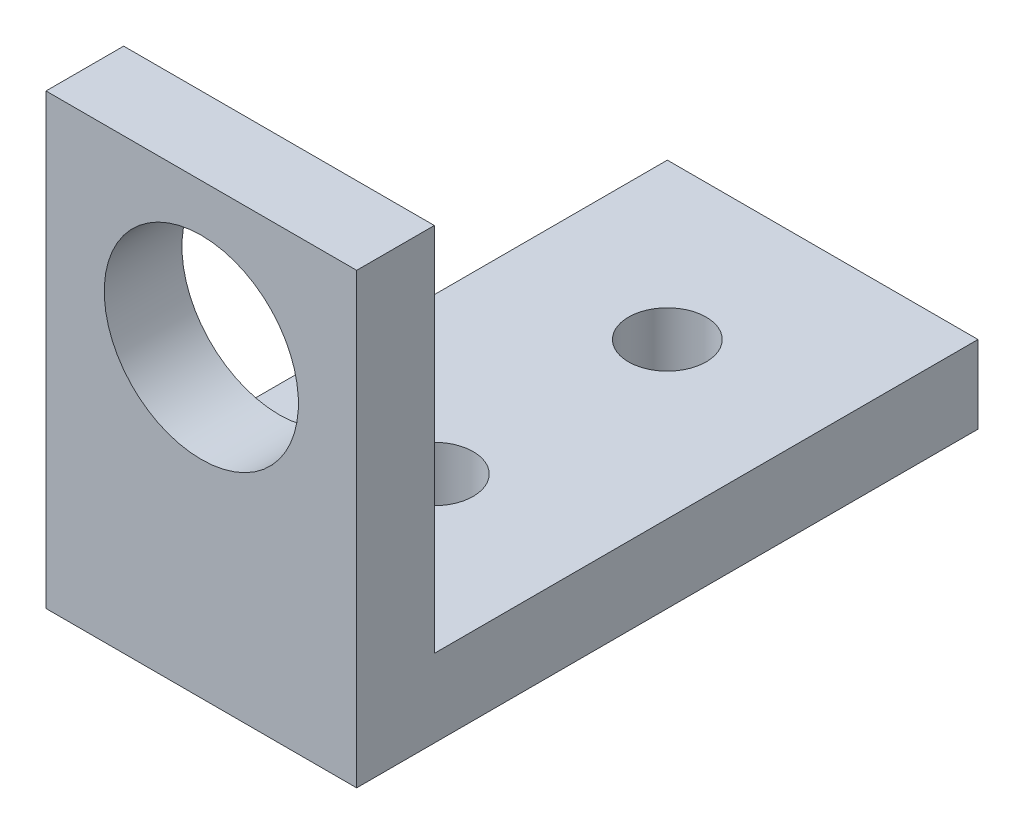
ISO-10303-21;
HEADER;
FILE_DESCRIPTION(('STEP AP214'),'2;1');
FILE_NAME('part.step','',(''),(''),'','','');
FILE_SCHEMA(('AUTOMOTIVE_DESIGN { 1 0 10303 214 1 1 1 1 }'));
ENDSEC;
DATA;
#1=APPLICATION_CONTEXT('core data for automotive mechanical design processes');
#2=APPLICATION_PROTOCOL_DEFINITION('international standard','automotive_design',2000,#1);
#3=PRODUCT_CONTEXT('',#1,'mechanical');
#4=PRODUCT('Part','Part','',(#3));
#5=PRODUCT_RELATED_PRODUCT_CATEGORY('part','',(#4));
#6=PRODUCT_DEFINITION_FORMATION('','',#4);
#7=PRODUCT_DEFINITION_CONTEXT('part definition',#1,'design');
#8=PRODUCT_DEFINITION('design','',#6,#7);
#9=PRODUCT_DEFINITION_SHAPE('','',#8);
#10=(LENGTH_UNIT() NAMED_UNIT(*) SI_UNIT(.MILLI.,.METRE.));
#11=(NAMED_UNIT(*) PLANE_ANGLE_UNIT() SI_UNIT($,.RADIAN.));
#12=(NAMED_UNIT(*) SI_UNIT($,.STERADIAN.) SOLID_ANGLE_UNIT());
#13=UNCERTAINTY_MEASURE_WITH_UNIT(LENGTH_MEASURE(1.E-05),#10,'distance_accuracy_value','');
#14=(GEOMETRIC_REPRESENTATION_CONTEXT(3) GLOBAL_UNCERTAINTY_ASSIGNED_CONTEXT((#13)) GLOBAL_UNIT_ASSIGNED_CONTEXT((#10,
#11,#12)) REPRESENTATION_CONTEXT('',''));
#15=CARTESIAN_POINT('',(0.,0.,0.));
#16=DIRECTION('',(0.,0.,1.));
#17=DIRECTION('',(1.,0.,0.));
#18=AXIS2_PLACEMENT_3D('',#15,#16,#17);
#19=CARTESIAN_POINT('',(25.4,76.2,-6.35));
#20=DIRECTION('',(0.,0.,1.));
#21=DIRECTION('',(0.,-1.,0.));
#22=AXIS2_PLACEMENT_3D('',#19,#20,#21);
#23=PLANE('',#22);
#24=DIRECTION('',(0.,1.,0.));
#25=VECTOR('',#24,1.);
#26=CARTESIAN_POINT('',(0.,76.2,-6.35));
#27=LINE('',#26,#25);
#28=CARTESIAN_POINT('',(0.,6.35,-6.35));
#29=VERTEX_POINT('',#28);
#30=CARTESIAN_POINT('',(0.,36.6475392003736,-6.35));
#31=VERTEX_POINT('',#30);
#32=EDGE_CURVE('E123',#29,#31,#27,.T.);
#33=ORIENTED_EDGE('',*,*,#32,.T.);
#34=DIRECTION('',(-1.,0.,0.));
#35=VECTOR('',#34,1.);
#36=CARTESIAN_POINT('',(0.,36.6475392003736,-6.35));
#37=LINE('',#36,#35);
#38=CARTESIAN_POINT('',(25.4,36.6475392003736,-6.35));
#39=VERTEX_POINT('',#38);
#40=EDGE_CURVE('E48',#39,#31,#37,.T.);
#41=ORIENTED_EDGE('',*,*,#40,.F.);
#42=DIRECTION('',(0.,1.,0.));
#43=VECTOR('',#42,1.);
#44=CARTESIAN_POINT('',(25.4,76.2,-6.35));
#45=LINE('',#44,#43);
#46=CARTESIAN_POINT('',(25.4,6.35,-6.35));
#47=VERTEX_POINT('',#46);
#48=EDGE_CURVE('E118',#47,#39,#45,.T.);
#49=ORIENTED_EDGE('',*,*,#48,.F.);
#50=DIRECTION('',(-1.,0.,0.));
#51=VECTOR('',#50,1.);
#52=CARTESIAN_POINT('',(25.4,6.35,-6.35));
#53=LINE('',#52,#51);
#54=EDGE_CURVE('E125',#47,#29,#53,.T.);
#55=ORIENTED_EDGE('',*,*,#54,.T.);
#56=EDGE_LOOP('',(#33,#41,#49,#55));
#57=FACE_BOUND('',#56,.T.);
#58=CARTESIAN_POINT('',(12.7,24.8412,-6.35));
#59=DIRECTION('',(0.,0.,-1.));
#60=DIRECTION('',(0.,1.,0.));
#61=AXIS2_PLACEMENT_3D('',#58,#59,#60);
#62=CIRCLE('',#61,7.93749999999999);
#63=CARTESIAN_POINT('',(12.7,32.7787,-6.35));
#64=VERTEX_POINT('',#63);
#65=EDGE_CURVE('E157',#64,#64,#62,.T.);
#66=ORIENTED_EDGE('',*,*,#65,.F.);
#67=EDGE_LOOP('',(#66));
#68=FACE_BOUND('',#67,.T.);
#69=ADVANCED_FACE('F33',(#57,#68),#23,.F.);
#70=CARTESIAN_POINT('',(25.4,76.2,0.));
#71=DIRECTION('',(0.,0.,-1.));
#72=DIRECTION('',(0.,1.,0.));
#73=AXIS2_PLACEMENT_3D('',#70,#71,#72);
#74=PLANE('',#73);
#75=CARTESIAN_POINT('',(12.7,24.8412,0.));
#76=DIRECTION('',(0.,0.,-1.));
#77=DIRECTION('',(0.,1.,0.));
#78=AXIS2_PLACEMENT_3D('',#75,#76,#77);
#79=CIRCLE('',#78,7.93749999999999);
#80=CARTESIAN_POINT('',(12.7,32.7787,0.));
#81=VERTEX_POINT('',#80);
#82=EDGE_CURVE('E154',#81,#81,#79,.T.);
#83=ORIENTED_EDGE('',*,*,#82,.T.);
#84=EDGE_LOOP('',(#83));
#85=FACE_BOUND('',#84,.T.);
#86=DIRECTION('',(0.,-1.,0.));
#87=VECTOR('',#86,1.);
#88=CARTESIAN_POINT('',(25.4,76.2,0.));
#89=LINE('',#88,#87);
#90=CARTESIAN_POINT('',(25.4,36.6475392003736,0.));
#91=VERTEX_POINT('',#90);
#92=CARTESIAN_POINT('',(25.4,0.,0.));
#93=VERTEX_POINT('',#92);
#94=EDGE_CURVE('E85',#91,#93,#89,.T.);
#95=ORIENTED_EDGE('',*,*,#94,.F.);
#96=DIRECTION('',(1.,0.,0.));
#97=VECTOR('',#96,1.);
#98=CARTESIAN_POINT('',(0.,36.6475392003736,0.));
#99=LINE('',#98,#97);
#100=CARTESIAN_POINT('',(0.,36.6475392003736,0.));
#101=VERTEX_POINT('',#100);
#102=EDGE_CURVE('E96',#101,#91,#99,.T.);
#103=ORIENTED_EDGE('',*,*,#102,.F.);
#104=DIRECTION('',(0.,-1.,0.));
#105=VECTOR('',#104,1.);
#106=CARTESIAN_POINT('',(0.,76.2,0.));
#107=LINE('',#106,#105);
#108=CARTESIAN_POINT('',(0.,0.,0.));
#109=VERTEX_POINT('',#108);
#110=EDGE_CURVE('E104',#101,#109,#107,.T.);
#111=ORIENTED_EDGE('',*,*,#110,.T.);
#112=DIRECTION('',(-1.,0.,0.));
#113=VECTOR('',#112,1.);
#114=CARTESIAN_POINT('',(25.4,0.,0.));
#115=LINE('',#114,#113);
#116=EDGE_CURVE('E11',#93,#109,#115,.T.);
#117=ORIENTED_EDGE('',*,*,#116,.F.);
#118=EDGE_LOOP('',(#95,#103,#111,#117));
#119=FACE_BOUND('',#118,.T.);
#120=ADVANCED_FACE('F35',(#85,#119),#74,.F.);
#121=CARTESIAN_POINT('',(25.4,0.,0.));
#122=DIRECTION('',(0.,1.,0.));
#123=DIRECTION('',(0.,0.,1.));
#124=AXIS2_PLACEMENT_3D('',#121,#122,#123);
#125=PLANE('',#124);
#126=CARTESIAN_POINT('',(12.7,0.,-19.05));
#127=DIRECTION('',(0.,1.,0.));
#128=DIRECTION('',(0.,0.,1.));
#129=AXIS2_PLACEMENT_3D('',#126,#127,#128);
#130=CIRCLE('',#129,3.175);
#131=CARTESIAN_POINT('',(12.7,0.,-15.875));
#132=VERTEX_POINT('',#131);
#133=EDGE_CURVE('E148',#132,#132,#130,.F.);
#134=ORIENTED_EDGE('',*,*,#133,.F.);
#135=EDGE_LOOP('',(#134));
#136=FACE_BOUND('',#135,.T.);
#137=CARTESIAN_POINT('',(12.7,0.,-38.1));
#138=DIRECTION('',(0.,1.,0.));
#139=DIRECTION('',(0.,0.,1.));
#140=AXIS2_PLACEMENT_3D('',#137,#138,#139);
#141=CIRCLE('',#140,3.175);
#142=CARTESIAN_POINT('',(12.7,0.,-34.925));
#143=VERTEX_POINT('',#142);
#144=EDGE_CURVE('E110',#143,#143,#141,.F.);
#145=ORIENTED_EDGE('',*,*,#144,.F.);
#146=EDGE_LOOP('',(#145));
#147=FACE_BOUND('',#146,.T.);
#148=DIRECTION('',(0.,0.,-1.));
#149=VECTOR('',#148,1.);
#150=CARTESIAN_POINT('',(0.,0.,0.));
#151=LINE('',#150,#149);
#152=CARTESIAN_POINT('',(0.,0.,-50.8));
#153=VERTEX_POINT('',#152);
#154=EDGE_CURVE('E109',#109,#153,#151,.T.);
#155=ORIENTED_EDGE('',*,*,#154,.T.);
#156=DIRECTION('',(-1.,0.,0.));
#157=VECTOR('',#156,1.);
#158=CARTESIAN_POINT('',(25.4,0.,-50.8));
#159=LINE('',#158,#157);
#160=CARTESIAN_POINT('',(25.4,0.,-50.8));
#161=VERTEX_POINT('',#160);
#162=EDGE_CURVE('E41',#161,#153,#159,.T.);
#163=ORIENTED_EDGE('',*,*,#162,.F.);
#164=DIRECTION('',(0.,0.,-1.));
#165=VECTOR('',#164,1.);
#166=CARTESIAN_POINT('',(25.4,0.,0.));
#167=LINE('',#166,#165);
#168=EDGE_CURVE('E141',#93,#161,#167,.T.);
#169=ORIENTED_EDGE('',*,*,#168,.F.);
#170=ORIENTED_EDGE('',*,*,#116,.T.);
#171=EDGE_LOOP('',(#155,#163,#169,#170));
#172=FACE_BOUND('',#171,.T.);
#173=ADVANCED_FACE('F179',(#136,#147,#172),#125,.F.);
#174=CARTESIAN_POINT('',(25.4,6.35,-50.8));
#175=DIRECTION('',(0.,0.,1.));
#176=DIRECTION('',(1.,0.,0.));
#177=AXIS2_PLACEMENT_3D('',#174,#175,#176);
#178=PLANE('',#177);
#179=DIRECTION('',(0.,1.,0.));
#180=VECTOR('',#179,1.);
#181=CARTESIAN_POINT('',(0.,6.35,-50.8));
#182=LINE('',#181,#180);
#183=CARTESIAN_POINT('',(0.,6.35,-50.8));
#184=VERTEX_POINT('',#183);
#185=EDGE_CURVE('E112',#153,#184,#182,.T.);
#186=ORIENTED_EDGE('',*,*,#185,.T.);
#187=DIRECTION('',(-1.,0.,0.));
#188=VECTOR('',#187,1.);
#189=CARTESIAN_POINT('',(25.4,6.35,-50.8));
#190=LINE('',#189,#188);
#191=CARTESIAN_POINT('',(25.4,6.35,-50.8));
#192=VERTEX_POINT('',#191);
#193=EDGE_CURVE('E127',#192,#184,#190,.T.);
#194=ORIENTED_EDGE('',*,*,#193,.F.);
#195=DIRECTION('',(0.,1.,0.));
#196=VECTOR('',#195,1.);
#197=CARTESIAN_POINT('',(25.4,6.35,-50.8));
#198=LINE('',#197,#196);
#199=EDGE_CURVE('E134',#161,#192,#198,.T.);
#200=ORIENTED_EDGE('',*,*,#199,.F.);
#201=ORIENTED_EDGE('',*,*,#162,.T.);
#202=EDGE_LOOP('',(#186,#194,#200,#201));
#203=FACE_BOUND('',#202,.T.);
#204=ADVANCED_FACE('F132',(#203),#178,.F.);
#205=CARTESIAN_POINT('',(25.4,6.35,-6.35));
#206=DIRECTION('',(0.,-1.,0.));
#207=DIRECTION('',(0.,0.,-1.));
#208=AXIS2_PLACEMENT_3D('',#205,#206,#207);
#209=PLANE('',#208);
#210=CARTESIAN_POINT('',(12.7,6.35,-19.05));
#211=DIRECTION('',(0.,1.,0.));
#212=DIRECTION('',(0.,0.,1.));
#213=AXIS2_PLACEMENT_3D('',#210,#211,#212);
#214=CIRCLE('',#213,3.175);
#215=CARTESIAN_POINT('',(12.7,6.35,-15.875));
#216=VERTEX_POINT('',#215);
#217=EDGE_CURVE('E151',#216,#216,#214,.T.);
#218=ORIENTED_EDGE('',*,*,#217,.F.);
#219=EDGE_LOOP('',(#218));
#220=FACE_BOUND('',#219,.T.);
#221=CARTESIAN_POINT('',(12.7,6.35,-38.1));
#222=DIRECTION('',(0.,1.,0.));
#223=DIRECTION('',(0.,0.,1.));
#224=AXIS2_PLACEMENT_3D('',#221,#222,#223);
#225=CIRCLE('',#224,3.175);
#226=CARTESIAN_POINT('',(12.7,6.35,-34.925));
#227=VERTEX_POINT('',#226);
#228=EDGE_CURVE('E115',#227,#227,#225,.T.);
#229=ORIENTED_EDGE('',*,*,#228,.F.);
#230=EDGE_LOOP('',(#229));
#231=FACE_BOUND('',#230,.T.);
#232=DIRECTION('',(0.,0.,1.));
#233=VECTOR('',#232,1.);
#234=CARTESIAN_POINT('',(0.,6.35,-6.35));
#235=LINE('',#234,#233);
#236=EDGE_CURVE('E78',#184,#29,#235,.T.);
#237=ORIENTED_EDGE('',*,*,#236,.T.);
#238=ORIENTED_EDGE('',*,*,#54,.F.);
#239=DIRECTION('',(0.,0.,1.));
#240=VECTOR('',#239,1.);
#241=CARTESIAN_POINT('',(25.4,6.35,-6.35));
#242=LINE('',#241,#240);
#243=EDGE_CURVE('E57',#192,#47,#242,.T.);
#244=ORIENTED_EDGE('',*,*,#243,.F.);
#245=ORIENTED_EDGE('',*,*,#193,.T.);
#246=EDGE_LOOP('',(#237,#238,#244,#245));
#247=FACE_BOUND('',#246,.T.);
#248=ADVANCED_FACE('F140',(#220,#231,#247),#209,.F.);
#249=CARTESIAN_POINT('',(25.4,0.,0.));
#250=DIRECTION('',(-1.,0.,0.));
#251=DIRECTION('',(0.,0.,1.));
#252=AXIS2_PLACEMENT_3D('',#249,#250,#251);
#253=PLANE('',#252);
#254=ORIENTED_EDGE('',*,*,#48,.T.);
#255=DIRECTION('',(0.,0.,1.));
#256=VECTOR('',#255,1.);
#257=CARTESIAN_POINT('',(25.4,36.6475392003736,-50.801));
#258=LINE('',#257,#256);
#259=EDGE_CURVE('E101',#39,#91,#258,.T.);
#260=ORIENTED_EDGE('',*,*,#259,.T.);
#261=ORIENTED_EDGE('',*,*,#94,.T.);
#262=ORIENTED_EDGE('',*,*,#168,.T.);
#263=ORIENTED_EDGE('',*,*,#199,.T.);
#264=ORIENTED_EDGE('',*,*,#243,.T.);
#265=EDGE_LOOP('',(#254,#260,#261,#262,#263,#264));
#266=FACE_BOUND('',#265,.T.);
#267=ADVANCED_FACE('F161',(#266),#253,.F.);
#268=CARTESIAN_POINT('',(0.,0.,0.));
#269=DIRECTION('',(-1.,0.,0.));
#270=DIRECTION('',(0.,0.,1.));
#271=AXIS2_PLACEMENT_3D('',#268,#269,#270);
#272=PLANE('',#271);
#273=DIRECTION('',(0.,0.,1.));
#274=VECTOR('',#273,1.);
#275=CARTESIAN_POINT('',(0.,36.6475392003736,-50.801));
#276=LINE('',#275,#274);
#277=EDGE_CURVE('E93',#31,#101,#276,.T.);
#278=ORIENTED_EDGE('',*,*,#277,.F.);
#279=ORIENTED_EDGE('',*,*,#32,.F.);
#280=ORIENTED_EDGE('',*,*,#236,.F.);
#281=ORIENTED_EDGE('',*,*,#185,.F.);
#282=ORIENTED_EDGE('',*,*,#154,.F.);
#283=ORIENTED_EDGE('',*,*,#110,.F.);
#284=EDGE_LOOP('',(#278,#279,#280,#281,#282,#283));
#285=FACE_BOUND('',#284,.T.);
#286=ADVANCED_FACE('F107',(#285),#272,.T.);
#287=CARTESIAN_POINT('',(12.7,-0.00100000000000013,-38.1));
#288=DIRECTION('',(0.,1.,0.));
#289=DIRECTION('',(0.,0.,1.));
#290=AXIS2_PLACEMENT_3D('',#287,#288,#289);
#291=CYLINDRICAL_SURFACE('',#290,3.175);
#292=ORIENTED_EDGE('',*,*,#228,.T.);
#293=EDGE_LOOP('',(#292));
#294=FACE_BOUND('',#293,.T.);
#295=ORIENTED_EDGE('',*,*,#144,.T.);
#296=EDGE_LOOP('',(#295));
#297=FACE_BOUND('',#296,.T.);
#298=ADVANCED_FACE('F168',(#294,#297),#291,.F.);
#299=CARTESIAN_POINT('',(12.7,-0.00100000000000013,-19.05));
#300=DIRECTION('',(0.,1.,0.));
#301=DIRECTION('',(0.,0.,1.));
#302=AXIS2_PLACEMENT_3D('',#299,#300,#301);
#303=CYLINDRICAL_SURFACE('',#302,3.175);
#304=ORIENTED_EDGE('',*,*,#217,.T.);
#305=EDGE_LOOP('',(#304));
#306=FACE_BOUND('',#305,.T.);
#307=ORIENTED_EDGE('',*,*,#133,.T.);
#308=EDGE_LOOP('',(#307));
#309=FACE_BOUND('',#308,.T.);
#310=ADVANCED_FACE('F193',(#306,#309),#303,.F.);
#311=CARTESIAN_POINT('',(12.7,24.8412,-6.35));
#312=DIRECTION('',(0.,0.,-1.));
#313=DIRECTION('',(0.,1.,0.));
#314=AXIS2_PLACEMENT_3D('',#311,#312,#313);
#315=CYLINDRICAL_SURFACE('',#314,7.93749999999999);
#316=ORIENTED_EDGE('',*,*,#82,.F.);
#317=EDGE_LOOP('',(#316));
#318=FACE_BOUND('',#317,.T.);
#319=ORIENTED_EDGE('',*,*,#65,.T.);
#320=EDGE_LOOP('',(#319));
#321=FACE_BOUND('',#320,.T.);
#322=ADVANCED_FACE('F199',(#318,#321),#315,.F.);
#323=CARTESIAN_POINT('',(0.,36.6475392003736,-50.801));
#324=DIRECTION('',(0.,-1.,0.));
#325=DIRECTION('',(0.,0.,-1.));
#326=AXIS2_PLACEMENT_3D('',#323,#324,#325);
#327=PLANE('',#326);
#328=ORIENTED_EDGE('',*,*,#40,.T.);
#329=ORIENTED_EDGE('',*,*,#277,.T.);
#330=ORIENTED_EDGE('',*,*,#102,.T.);
#331=ORIENTED_EDGE('',*,*,#259,.F.);
#332=EDGE_LOOP('',(#328,#329,#330,#331));
#333=FACE_BOUND('',#332,.T.);
#334=ADVANCED_FACE('F95',(#333),#327,.F.);
#335=CLOSED_SHELL('',(#69,#120,#173,#204,#248,#267,#286,#298,#310,#322,#334));
#336=MANIFOLD_SOLID_BREP('B2',#335);
#337=ADVANCED_BREP_SHAPE_REPRESENTATION('',(#18,#336),#14);
#338=SHAPE_DEFINITION_REPRESENTATION(#9,#337);
ENDSEC;
END-ISO-10303-21;
